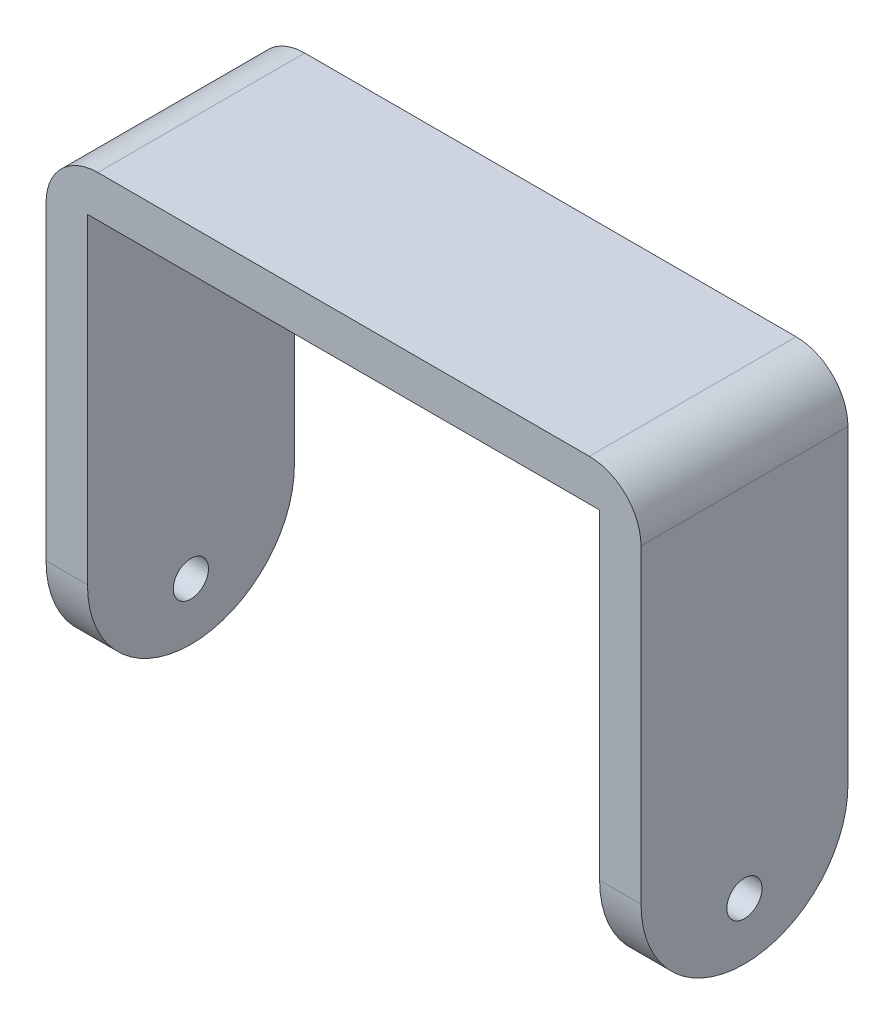
ISO-10303-21;
HEADER;
FILE_DESCRIPTION(('STEP AP214'),'2;1');
FILE_NAME('part.step','',(''),(''),'','','');
FILE_SCHEMA(('AUTOMOTIVE_DESIGN { 1 0 10303 214 1 1 1 1 }'));
ENDSEC;
DATA;
#1=APPLICATION_CONTEXT('core data for automotive mechanical design processes');
#2=APPLICATION_PROTOCOL_DEFINITION('international standard','automotive_design',2000,#1);
#3=PRODUCT_CONTEXT('',#1,'mechanical');
#4=PRODUCT('Part','Part','',(#3));
#5=PRODUCT_RELATED_PRODUCT_CATEGORY('part','',(#4));
#6=PRODUCT_DEFINITION_FORMATION('','',#4);
#7=PRODUCT_DEFINITION_CONTEXT('part definition',#1,'design');
#8=PRODUCT_DEFINITION('design','',#6,#7);
#9=PRODUCT_DEFINITION_SHAPE('','',#8);
#10=(LENGTH_UNIT() NAMED_UNIT(*) SI_UNIT(.MILLI.,.METRE.));
#11=(NAMED_UNIT(*) PLANE_ANGLE_UNIT() SI_UNIT($,.RADIAN.));
#12=(NAMED_UNIT(*) SI_UNIT($,.STERADIAN.) SOLID_ANGLE_UNIT());
#13=UNCERTAINTY_MEASURE_WITH_UNIT(LENGTH_MEASURE(1.E-05),#10,'distance_accuracy_value','');
#14=(GEOMETRIC_REPRESENTATION_CONTEXT(3) GLOBAL_UNCERTAINTY_ASSIGNED_CONTEXT((#13)) GLOBAL_UNIT_ASSIGNED_CONTEXT((#10,
#11,#12)) REPRESENTATION_CONTEXT('',''));
#15=CARTESIAN_POINT('',(0.,0.,0.));
#16=DIRECTION('',(0.,0.,1.));
#17=DIRECTION('',(1.,0.,0.));
#18=AXIS2_PLACEMENT_3D('',#15,#16,#17);
#19=CARTESIAN_POINT('',(0.,45.,20.));
#20=DIRECTION('',(1.,0.,0.));
#21=DIRECTION('',(0.,0.,-1.));
#22=AXIS2_PLACEMENT_3D('',#19,#20,#21);
#23=PLANE('',#22);
#24=DIRECTION('',(0.,-1.,0.));
#25=VECTOR('',#24,1.);
#26=CARTESIAN_POINT('',(0.,45.,20.));
#27=LINE('',#26,#25);
#28=CARTESIAN_POINT('',(0.,40.,20.));
#29=VERTEX_POINT('',#28);
#30=CARTESIAN_POINT('',(0.,10.,20.));
#31=VERTEX_POINT('',#30);
#32=EDGE_CURVE('E142',#29,#31,#27,.T.);
#33=ORIENTED_EDGE('',*,*,#32,.F.);
#34=DIRECTION('',(0.,0.,-1.));
#35=VECTOR('',#34,1.);
#36=CARTESIAN_POINT('',(0.,40.,20.));
#37=LINE('',#36,#35);
#38=CARTESIAN_POINT('',(0.,40.,0.));
#39=VERTEX_POINT('',#38);
#40=EDGE_CURVE('E229',#29,#39,#37,.T.);
#41=ORIENTED_EDGE('',*,*,#40,.T.);
#42=DIRECTION('',(0.,-1.,0.));
#43=VECTOR('',#42,1.);
#44=CARTESIAN_POINT('',(0.,45.,0.));
#45=LINE('',#44,#43);
#46=CARTESIAN_POINT('',(0.,10.,0.));
#47=VERTEX_POINT('',#46);
#48=EDGE_CURVE('E171',#39,#47,#45,.T.);
#49=ORIENTED_EDGE('',*,*,#48,.T.);
#50=CARTESIAN_POINT('',(0.,10.,10.));
#51=DIRECTION('',(1.,0.,0.));
#52=DIRECTION('',(0.,0.,-1.));
#53=AXIS2_PLACEMENT_3D('',#50,#51,#52);
#54=CIRCLE('',#53,10.);
#55=CARTESIAN_POINT('',(0.,0.,10.));
#56=VERTEX_POINT('',#55);
#57=EDGE_CURVE('E226',#47,#56,#54,.F.);
#58=ORIENTED_EDGE('',*,*,#57,.T.);
#59=CARTESIAN_POINT('',(0.,10.,10.));
#60=DIRECTION('',(1.,0.,0.));
#61=DIRECTION('',(0.,0.,-1.));
#62=AXIS2_PLACEMENT_3D('',#59,#60,#61);
#63=CIRCLE('',#62,10.);
#64=EDGE_CURVE('E222',#56,#31,#63,.F.);
#65=ORIENTED_EDGE('',*,*,#64,.T.);
#66=EDGE_LOOP('',(#33,#41,#49,#58,#65));
#67=FACE_BOUND('',#66,.T.);
#68=CARTESIAN_POINT('',(0.,5.5,10.));
#69=DIRECTION('',(1.,0.,0.));
#70=DIRECTION('',(0.,0.,-1.));
#71=AXIS2_PLACEMENT_3D('',#68,#69,#70);
#72=CIRCLE('',#71,1.69999999999999);
#73=CARTESIAN_POINT('',(0.,5.5,8.30000000000001));
#74=VERTEX_POINT('',#73);
#75=EDGE_CURVE('E436',#74,#74,#72,.F.);
#76=ORIENTED_EDGE('',*,*,#75,.F.);
#77=EDGE_LOOP('',(#76));
#78=FACE_BOUND('',#77,.T.);
#79=ADVANCED_FACE('F39',(#67,#78),#23,.F.);
#80=CARTESIAN_POINT('',(3.99999999999999,0.,20.));
#81=DIRECTION('',(-1.,0.,0.));
#82=DIRECTION('',(0.,-1.,0.));
#83=AXIS2_PLACEMENT_3D('',#80,#81,#82);
#84=PLANE('',#83);
#85=CARTESIAN_POINT('',(3.99999999999999,5.5,10.));
#86=DIRECTION('',(-1.,0.,0.));
#87=DIRECTION('',(0.,-1.,0.));
#88=AXIS2_PLACEMENT_3D('',#85,#86,#87);
#89=CIRCLE('',#88,1.69999999999999);
#90=CARTESIAN_POINT('',(3.99999999999999,3.80000000000001,10.));
#91=VERTEX_POINT('',#90);
#92=EDGE_CURVE('E174',#91,#91,#89,.T.);
#93=ORIENTED_EDGE('',*,*,#92,.T.);
#94=EDGE_LOOP('',(#93));
#95=FACE_BOUND('',#94,.T.);
#96=CARTESIAN_POINT('',(3.99999999999999,10.,10.));
#97=DIRECTION('',(-1.,0.,0.));
#98=DIRECTION('',(0.,-1.,0.));
#99=AXIS2_PLACEMENT_3D('',#96,#97,#98);
#100=CIRCLE('',#99,10.);
#101=CARTESIAN_POINT('',(3.99999999999999,10.,20.));
#102=VERTEX_POINT('',#101);
#103=CARTESIAN_POINT('',(3.99999999999999,0.,10.));
#104=VERTEX_POINT('',#103);
#105=EDGE_CURVE('E216',#102,#104,#100,.F.);
#106=ORIENTED_EDGE('',*,*,#105,.T.);
#107=CARTESIAN_POINT('',(3.99999999999999,10.,10.));
#108=DIRECTION('',(-1.,0.,0.));
#109=DIRECTION('',(0.,-1.,0.));
#110=AXIS2_PLACEMENT_3D('',#107,#108,#109);
#111=CIRCLE('',#110,10.);
#112=CARTESIAN_POINT('',(3.99999999999999,10.,0.));
#113=VERTEX_POINT('',#112);
#114=EDGE_CURVE('E219',#104,#113,#111,.F.);
#115=ORIENTED_EDGE('',*,*,#114,.T.);
#116=DIRECTION('',(0.,1.,0.));
#117=VECTOR('',#116,1.);
#118=CARTESIAN_POINT('',(3.99999999999999,0.,0.));
#119=LINE('',#118,#117);
#120=CARTESIAN_POINT('',(4.,41.,0.));
#121=VERTEX_POINT('',#120);
#122=EDGE_CURVE('E148',#113,#121,#119,.T.);
#123=ORIENTED_EDGE('',*,*,#122,.T.);
#124=DIRECTION('',(0.,0.,-1.));
#125=VECTOR('',#124,1.);
#126=CARTESIAN_POINT('',(4.,41.,20.));
#127=LINE('',#126,#125);
#128=CARTESIAN_POINT('',(4.,41.,20.));
#129=VERTEX_POINT('',#128);
#130=EDGE_CURVE('E145',#129,#121,#127,.T.);
#131=ORIENTED_EDGE('',*,*,#130,.F.);
#132=DIRECTION('',(0.,1.,0.));
#133=VECTOR('',#132,1.);
#134=CARTESIAN_POINT('',(3.99999999999999,0.,20.));
#135=LINE('',#134,#133);
#136=EDGE_CURVE('E130',#102,#129,#135,.T.);
#137=ORIENTED_EDGE('',*,*,#136,.F.);
#138=EDGE_LOOP('',(#106,#115,#123,#131,#137));
#139=FACE_BOUND('',#138,.T.);
#140=ADVANCED_FACE('F146',(#95,#139),#84,.F.);
#141=CARTESIAN_POINT('',(4.,41.,20.));
#142=DIRECTION('',(0.,1.,0.));
#143=DIRECTION('',(0.,0.,1.));
#144=AXIS2_PLACEMENT_3D('',#141,#142,#143);
#145=PLANE('',#144);
#146=DIRECTION('',(1.,0.,0.));
#147=VECTOR('',#146,1.);
#148=CARTESIAN_POINT('',(4.,41.,0.));
#149=LINE('',#148,#147);
#150=CARTESIAN_POINT('',(53.5,41.,0.));
#151=VERTEX_POINT('',#150);
#152=EDGE_CURVE('E177',#121,#151,#149,.T.);
#153=ORIENTED_EDGE('',*,*,#152,.T.);
#154=DIRECTION('',(0.,0.,-1.));
#155=VECTOR('',#154,1.);
#156=CARTESIAN_POINT('',(53.5,41.,20.));
#157=LINE('',#156,#155);
#158=CARTESIAN_POINT('',(53.5,41.,20.));
#159=VERTEX_POINT('',#158);
#160=EDGE_CURVE('E153',#159,#151,#157,.T.);
#161=ORIENTED_EDGE('',*,*,#160,.F.);
#162=DIRECTION('',(1.,0.,0.));
#163=VECTOR('',#162,1.);
#164=CARTESIAN_POINT('',(4.,41.,20.));
#165=LINE('',#164,#163);
#166=EDGE_CURVE('E135',#129,#159,#165,.T.);
#167=ORIENTED_EDGE('',*,*,#166,.F.);
#168=ORIENTED_EDGE('',*,*,#130,.T.);
#169=EDGE_LOOP('',(#153,#161,#167,#168));
#170=FACE_BOUND('',#169,.T.);
#171=ADVANCED_FACE('F155',(#170),#145,.F.);
#172=CARTESIAN_POINT('',(53.5,41.,20.));
#173=DIRECTION('',(1.,0.,0.));
#174=DIRECTION('',(0.,1.,0.));
#175=AXIS2_PLACEMENT_3D('',#172,#173,#174);
#176=PLANE('',#175);
#177=CARTESIAN_POINT('',(53.5,5.5,10.));
#178=DIRECTION('',(1.,0.,0.));
#179=DIRECTION('',(0.,1.,0.));
#180=AXIS2_PLACEMENT_3D('',#177,#178,#179);
#181=CIRCLE('',#180,1.69999999999999);
#182=CARTESIAN_POINT('',(53.5,7.19999999999999,10.));
#183=VERTEX_POINT('',#182);
#184=EDGE_CURVE('E434',#183,#183,#181,.T.);
#185=ORIENTED_EDGE('',*,*,#184,.T.);
#186=EDGE_LOOP('',(#185));
#187=FACE_BOUND('',#186,.T.);
#188=DIRECTION('',(0.,-1.,0.));
#189=VECTOR('',#188,1.);
#190=CARTESIAN_POINT('',(53.5,41.,0.));
#191=LINE('',#190,#189);
#192=CARTESIAN_POINT('',(53.5,10.,0.));
#193=VERTEX_POINT('',#192);
#194=EDGE_CURVE('E180',#151,#193,#191,.T.);
#195=ORIENTED_EDGE('',*,*,#194,.T.);
#196=CARTESIAN_POINT('',(53.5,10.,10.));
#197=DIRECTION('',(1.,0.,0.));
#198=DIRECTION('',(0.,1.,0.));
#199=AXIS2_PLACEMENT_3D('',#196,#197,#198);
#200=CIRCLE('',#199,10.);
#201=CARTESIAN_POINT('',(53.5,0.,10.));
#202=VERTEX_POINT('',#201);
#203=EDGE_CURVE('E208',#193,#202,#200,.F.);
#204=ORIENTED_EDGE('',*,*,#203,.T.);
#205=CARTESIAN_POINT('',(53.5,10.,10.));
#206=DIRECTION('',(1.,0.,0.));
#207=DIRECTION('',(0.,1.,0.));
#208=AXIS2_PLACEMENT_3D('',#205,#206,#207);
#209=CIRCLE('',#208,10.);
#210=CARTESIAN_POINT('',(53.5,10.,20.));
#211=VERTEX_POINT('',#210);
#212=EDGE_CURVE('E205',#202,#211,#209,.F.);
#213=ORIENTED_EDGE('',*,*,#212,.T.);
#214=DIRECTION('',(0.,-1.,0.));
#215=VECTOR('',#214,1.);
#216=CARTESIAN_POINT('',(53.5,41.,20.));
#217=LINE('',#216,#215);
#218=EDGE_CURVE('E159',#159,#211,#217,.T.);
#219=ORIENTED_EDGE('',*,*,#218,.F.);
#220=ORIENTED_EDGE('',*,*,#160,.T.);
#221=EDGE_LOOP('',(#195,#204,#213,#219,#220));
#222=FACE_BOUND('',#221,.T.);
#223=ADVANCED_FACE('F284',(#187,#222),#176,.F.);
#224=CARTESIAN_POINT('',(57.5,0.,20.));
#225=DIRECTION('',(-1.,0.,0.));
#226=DIRECTION('',(0.,0.,1.));
#227=AXIS2_PLACEMENT_3D('',#224,#225,#226);
#228=PLANE('',#227);
#229=CARTESIAN_POINT('',(57.5,5.5,10.));
#230=DIRECTION('',(1.,0.,0.));
#231=DIRECTION('',(0.,0.,-1.));
#232=AXIS2_PLACEMENT_3D('',#229,#230,#231);
#233=CIRCLE('',#232,1.69999999999999);
#234=CARTESIAN_POINT('',(57.5,5.5,8.30000000000001));
#235=VERTEX_POINT('',#234);
#236=EDGE_CURVE('E234',#235,#235,#233,.T.);
#237=ORIENTED_EDGE('',*,*,#236,.F.);
#238=EDGE_LOOP('',(#237));
#239=FACE_BOUND('',#238,.T.);
#240=DIRECTION('',(0.,1.,0.));
#241=VECTOR('',#240,1.);
#242=CARTESIAN_POINT('',(57.5,0.,0.));
#243=LINE('',#242,#241);
#244=CARTESIAN_POINT('',(57.5,10.,0.));
#245=VERTEX_POINT('',#244);
#246=CARTESIAN_POINT('',(57.5,40.,0.));
#247=VERTEX_POINT('',#246);
#248=EDGE_CURVE('E184',#245,#247,#243,.T.);
#249=ORIENTED_EDGE('',*,*,#248,.T.);
#250=DIRECTION('',(0.,0.,-1.));
#251=VECTOR('',#250,1.);
#252=CARTESIAN_POINT('',(57.5,40.,20.));
#253=LINE('',#252,#251);
#254=CARTESIAN_POINT('',(57.5,40.,20.));
#255=VERTEX_POINT('',#254);
#256=EDGE_CURVE('E11',#247,#255,#253,.F.);
#257=ORIENTED_EDGE('',*,*,#256,.T.);
#258=DIRECTION('',(0.,1.,0.));
#259=VECTOR('',#258,1.);
#260=CARTESIAN_POINT('',(57.5,0.,20.));
#261=LINE('',#260,#259);
#262=CARTESIAN_POINT('',(57.5,10.,20.));
#263=VERTEX_POINT('',#262);
#264=EDGE_CURVE('E162',#263,#255,#261,.T.);
#265=ORIENTED_EDGE('',*,*,#264,.F.);
#266=CARTESIAN_POINT('',(57.5,10.,10.));
#267=DIRECTION('',(-1.,0.,0.));
#268=DIRECTION('',(0.,0.,1.));
#269=AXIS2_PLACEMENT_3D('',#266,#267,#268);
#270=CIRCLE('',#269,10.);
#271=CARTESIAN_POINT('',(57.5,0.,10.));
#272=VERTEX_POINT('',#271);
#273=EDGE_CURVE('E152',#263,#272,#270,.F.);
#274=ORIENTED_EDGE('',*,*,#273,.T.);
#275=CARTESIAN_POINT('',(57.5,10.,10.));
#276=DIRECTION('',(-1.,0.,0.));
#277=DIRECTION('',(0.,0.,1.));
#278=AXIS2_PLACEMENT_3D('',#275,#276,#277);
#279=CIRCLE('',#278,10.);
#280=EDGE_CURVE('E194',#272,#245,#279,.F.);
#281=ORIENTED_EDGE('',*,*,#280,.T.);
#282=EDGE_LOOP('',(#249,#257,#265,#274,#281));
#283=FACE_BOUND('',#282,.T.);
#284=ADVANCED_FACE('F276',(#239,#283),#228,.F.);
#285=CARTESIAN_POINT('',(57.5,45.,20.));
#286=DIRECTION('',(0.,-1.,0.));
#287=DIRECTION('',(0.,0.,-1.));
#288=AXIS2_PLACEMENT_3D('',#285,#286,#287);
#289=PLANE('',#288);
#290=DIRECTION('',(-1.,0.,0.));
#291=VECTOR('',#290,1.);
#292=CARTESIAN_POINT('',(57.5,45.,0.));
#293=LINE('',#292,#291);
#294=CARTESIAN_POINT('',(52.5,45.,0.));
#295=VERTEX_POINT('',#294);
#296=CARTESIAN_POINT('',(5.,45.,0.));
#297=VERTEX_POINT('',#296);
#298=EDGE_CURVE('E187',#295,#297,#293,.T.);
#299=ORIENTED_EDGE('',*,*,#298,.T.);
#300=DIRECTION('',(0.,0.,-1.));
#301=VECTOR('',#300,1.);
#302=CARTESIAN_POINT('',(5.,45.,20.));
#303=LINE('',#302,#301);
#304=CARTESIAN_POINT('',(5.,45.,20.));
#305=VERTEX_POINT('',#304);
#306=EDGE_CURVE('E61',#297,#305,#303,.F.);
#307=ORIENTED_EDGE('',*,*,#306,.T.);
#308=DIRECTION('',(-1.,0.,0.));
#309=VECTOR('',#308,1.);
#310=CARTESIAN_POINT('',(57.5,45.,20.));
#311=LINE('',#310,#309);
#312=CARTESIAN_POINT('',(52.5,45.,20.));
#313=VERTEX_POINT('',#312);
#314=EDGE_CURVE('E168',#313,#305,#311,.T.);
#315=ORIENTED_EDGE('',*,*,#314,.F.);
#316=DIRECTION('',(0.,0.,-1.));
#317=VECTOR('',#316,1.);
#318=CARTESIAN_POINT('',(52.5,45.,20.));
#319=LINE('',#318,#317);
#320=EDGE_CURVE('E248',#313,#295,#319,.T.);
#321=ORIENTED_EDGE('',*,*,#320,.T.);
#322=EDGE_LOOP('',(#299,#307,#315,#321));
#323=FACE_BOUND('',#322,.T.);
#324=ADVANCED_FACE('F270',(#323),#289,.F.);
#325=CARTESIAN_POINT('',(0.,0.,20.));
#326=DIRECTION('',(0.,0.,1.));
#327=DIRECTION('',(1.,0.,0.));
#328=AXIS2_PLACEMENT_3D('',#325,#326,#327);
#329=PLANE('',#328);
#330=ORIENTED_EDGE('',*,*,#314,.T.);
#331=CARTESIAN_POINT('',(5.,40.,20.));
#332=DIRECTION('',(0.,0.,1.));
#333=DIRECTION('',(1.,0.,0.));
#334=AXIS2_PLACEMENT_3D('',#331,#332,#333);
#335=CIRCLE('',#334,5.);
#336=EDGE_CURVE('E48',#305,#29,#335,.T.);
#337=ORIENTED_EDGE('',*,*,#336,.T.);
#338=ORIENTED_EDGE('',*,*,#32,.T.);
#339=DIRECTION('',(1.,0.,0.));
#340=VECTOR('',#339,1.);
#341=CARTESIAN_POINT('',(3.99999999999999,10.,20.));
#342=LINE('',#341,#340);
#343=EDGE_CURVE('E138',#31,#102,#342,.T.);
#344=ORIENTED_EDGE('',*,*,#343,.T.);
#345=ORIENTED_EDGE('',*,*,#136,.T.);
#346=ORIENTED_EDGE('',*,*,#166,.T.);
#347=ORIENTED_EDGE('',*,*,#218,.T.);
#348=DIRECTION('',(1.,0.,0.));
#349=VECTOR('',#348,1.);
#350=CARTESIAN_POINT('',(57.5,10.,20.));
#351=LINE('',#350,#349);
#352=EDGE_CURVE('E213',#211,#263,#351,.T.);
#353=ORIENTED_EDGE('',*,*,#352,.T.);
#354=ORIENTED_EDGE('',*,*,#264,.T.);
#355=CARTESIAN_POINT('',(52.5,40.,20.));
#356=DIRECTION('',(0.,0.,1.));
#357=DIRECTION('',(1.,0.,0.));
#358=AXIS2_PLACEMENT_3D('',#355,#356,#357);
#359=CIRCLE('',#358,5.);
#360=EDGE_CURVE('E254',#255,#313,#359,.T.);
#361=ORIENTED_EDGE('',*,*,#360,.T.);
#362=EDGE_LOOP('',(#330,#337,#338,#344,#345,#346,#347,#353,#354,#361));
#363=FACE_BOUND('',#362,.T.);
#364=ADVANCED_FACE('F132',(#363),#329,.T.);
#365=CARTESIAN_POINT('',(0.,0.,0.));
#366=DIRECTION('',(0.,0.,1.));
#367=DIRECTION('',(1.,0.,0.));
#368=AXIS2_PLACEMENT_3D('',#365,#366,#367);
#369=PLANE('',#368);
#370=ORIENTED_EDGE('',*,*,#48,.F.);
#371=CARTESIAN_POINT('',(5.,40.,0.));
#372=DIRECTION('',(0.,0.,1.));
#373=DIRECTION('',(1.,0.,0.));
#374=AXIS2_PLACEMENT_3D('',#371,#372,#373);
#375=CIRCLE('',#374,5.);
#376=EDGE_CURVE('E245',#39,#297,#375,.F.);
#377=ORIENTED_EDGE('',*,*,#376,.T.);
#378=ORIENTED_EDGE('',*,*,#298,.F.);
#379=CARTESIAN_POINT('',(52.5,40.,0.));
#380=DIRECTION('',(0.,0.,1.));
#381=DIRECTION('',(1.,0.,0.));
#382=AXIS2_PLACEMENT_3D('',#379,#380,#381);
#383=CIRCLE('',#382,5.);
#384=EDGE_CURVE('E242',#295,#247,#383,.F.);
#385=ORIENTED_EDGE('',*,*,#384,.T.);
#386=ORIENTED_EDGE('',*,*,#248,.F.);
#387=DIRECTION('',(1.,0.,0.));
#388=VECTOR('',#387,1.);
#389=CARTESIAN_POINT('',(0.,10.,0.));
#390=LINE('',#389,#388);
#391=EDGE_CURVE('E201',#245,#193,#390,.F.);
#392=ORIENTED_EDGE('',*,*,#391,.T.);
#393=ORIENTED_EDGE('',*,*,#194,.F.);
#394=ORIENTED_EDGE('',*,*,#152,.F.);
#395=ORIENTED_EDGE('',*,*,#122,.F.);
#396=DIRECTION('',(1.,0.,0.));
#397=VECTOR('',#396,1.);
#398=CARTESIAN_POINT('',(0.,10.,0.));
#399=LINE('',#398,#397);
#400=EDGE_CURVE('E197',#113,#47,#399,.F.);
#401=ORIENTED_EDGE('',*,*,#400,.T.);
#402=EDGE_LOOP('',(#370,#377,#378,#385,#386,#392,#393,#394,#395,#401));
#403=FACE_BOUND('',#402,.T.);
#404=ADVANCED_FACE('F269',(#403),#369,.F.);
#405=CARTESIAN_POINT('',(57.5,5.5,10.));
#406=DIRECTION('',(1.,0.,0.));
#407=DIRECTION('',(0.,0.,-1.));
#408=AXIS2_PLACEMENT_3D('',#405,#406,#407);
#409=CYLINDRICAL_SURFACE('',#408,1.69999999999999);
#410=ORIENTED_EDGE('',*,*,#236,.T.);
#411=EDGE_LOOP('',(#410));
#412=FACE_BOUND('',#411,.T.);
#413=ORIENTED_EDGE('',*,*,#184,.F.);
#414=EDGE_LOOP('',(#413));
#415=FACE_BOUND('',#414,.T.);
#416=ADVANCED_FACE('F298',(#412,#415),#409,.F.);
#417=ORIENTED_EDGE('',*,*,#75,.T.);
#418=EDGE_LOOP('',(#417));
#419=FACE_BOUND('',#418,.T.);
#420=ORIENTED_EDGE('',*,*,#92,.F.);
#421=EDGE_LOOP('',(#420));
#422=FACE_BOUND('',#421,.T.);
#423=ADVANCED_FACE('F290',(#419,#422),#409,.F.);
#424=CARTESIAN_POINT('',(0.,10.,10.));
#425=DIRECTION('',(-1.,0.,0.));
#426=DIRECTION('',(0.,0.,1.));
#427=AXIS2_PLACEMENT_3D('',#424,#425,#426);
#428=CYLINDRICAL_SURFACE('',#427,10.);
#429=ORIENTED_EDGE('',*,*,#352,.F.);
#430=ORIENTED_EDGE('',*,*,#212,.F.);
#431=DIRECTION('',(1.,0.,0.));
#432=VECTOR('',#431,1.);
#433=CARTESIAN_POINT('',(53.5,0.,10.));
#434=LINE('',#433,#432);
#435=EDGE_CURVE('E230',#272,#202,#434,.F.);
#436=ORIENTED_EDGE('',*,*,#435,.F.);
#437=ORIENTED_EDGE('',*,*,#273,.F.);
#438=EDGE_LOOP('',(#429,#430,#436,#437));
#439=FACE_BOUND('',#438,.T.);
#440=ADVANCED_FACE('F288',(#439),#428,.T.);
#441=CARTESIAN_POINT('',(53.5,10.,10.));
#442=DIRECTION('',(1.,0.,0.));
#443=DIRECTION('',(0.,0.,-1.));
#444=AXIS2_PLACEMENT_3D('',#441,#442,#443);
#445=CYLINDRICAL_SURFACE('',#444,10.);
#446=ORIENTED_EDGE('',*,*,#203,.F.);
#447=ORIENTED_EDGE('',*,*,#391,.F.);
#448=ORIENTED_EDGE('',*,*,#280,.F.);
#449=ORIENTED_EDGE('',*,*,#435,.T.);
#450=EDGE_LOOP('',(#446,#447,#448,#449));
#451=FACE_BOUND('',#450,.T.);
#452=ADVANCED_FACE('F281',(#451),#445,.T.);
#453=CARTESIAN_POINT('',(0.,10.,10.));
#454=DIRECTION('',(-1.,0.,0.));
#455=DIRECTION('',(0.,0.,1.));
#456=AXIS2_PLACEMENT_3D('',#453,#454,#455);
#457=CYLINDRICAL_SURFACE('',#456,10.);
#458=ORIENTED_EDGE('',*,*,#343,.F.);
#459=ORIENTED_EDGE('',*,*,#64,.F.);
#460=DIRECTION('',(1.,0.,0.));
#461=VECTOR('',#460,1.);
#462=CARTESIAN_POINT('',(0.,0.,10.));
#463=LINE('',#462,#461);
#464=EDGE_CURVE('E235',#104,#56,#463,.F.);
#465=ORIENTED_EDGE('',*,*,#464,.F.);
#466=ORIENTED_EDGE('',*,*,#105,.F.);
#467=EDGE_LOOP('',(#458,#459,#465,#466));
#468=FACE_BOUND('',#467,.T.);
#469=ADVANCED_FACE('F296',(#468),#457,.T.);
#470=CARTESIAN_POINT('',(0.,10.,10.));
#471=DIRECTION('',(1.,0.,0.));
#472=DIRECTION('',(0.,0.,-1.));
#473=AXIS2_PLACEMENT_3D('',#470,#471,#472);
#474=CYLINDRICAL_SURFACE('',#473,10.);
#475=ORIENTED_EDGE('',*,*,#57,.F.);
#476=ORIENTED_EDGE('',*,*,#400,.F.);
#477=ORIENTED_EDGE('',*,*,#114,.F.);
#478=ORIENTED_EDGE('',*,*,#464,.T.);
#479=EDGE_LOOP('',(#475,#476,#477,#478));
#480=FACE_BOUND('',#479,.T.);
#481=ADVANCED_FACE('F376',(#480),#474,.T.);
#482=CARTESIAN_POINT('',(5.,40.,20.));
#483=DIRECTION('',(0.,0.,-1.));
#484=DIRECTION('',(-1.,0.,0.));
#485=AXIS2_PLACEMENT_3D('',#482,#483,#484);
#486=CYLINDRICAL_SURFACE('',#485,5.);
#487=ORIENTED_EDGE('',*,*,#336,.F.);
#488=ORIENTED_EDGE('',*,*,#306,.F.);
#489=ORIENTED_EDGE('',*,*,#376,.F.);
#490=ORIENTED_EDGE('',*,*,#40,.F.);
#491=EDGE_LOOP('',(#487,#488,#489,#490));
#492=FACE_BOUND('',#491,.T.);
#493=ADVANCED_FACE('F266',(#492),#486,.T.);
#494=CARTESIAN_POINT('',(52.5,40.,20.));
#495=DIRECTION('',(0.,0.,-1.));
#496=DIRECTION('',(-1.,0.,0.));
#497=AXIS2_PLACEMENT_3D('',#494,#495,#496);
#498=CYLINDRICAL_SURFACE('',#497,5.);
#499=ORIENTED_EDGE('',*,*,#360,.F.);
#500=ORIENTED_EDGE('',*,*,#256,.F.);
#501=ORIENTED_EDGE('',*,*,#384,.F.);
#502=ORIENTED_EDGE('',*,*,#320,.F.);
#503=EDGE_LOOP('',(#499,#500,#501,#502));
#504=FACE_BOUND('',#503,.T.);
#505=ADVANCED_FACE('F41',(#504),#498,.T.);
#506=CLOSED_SHELL('',(#79,#140,#171,#223,#284,#324,#364,#404,#416,#423,#440,#452,#469,#481,#493,#505));
#507=MANIFOLD_SOLID_BREP('B2',#506);
#508=ADVANCED_BREP_SHAPE_REPRESENTATION('',(#18,#507),#14);
#509=SHAPE_DEFINITION_REPRESENTATION(#9,#508);
ENDSEC;
END-ISO-10303-21;
